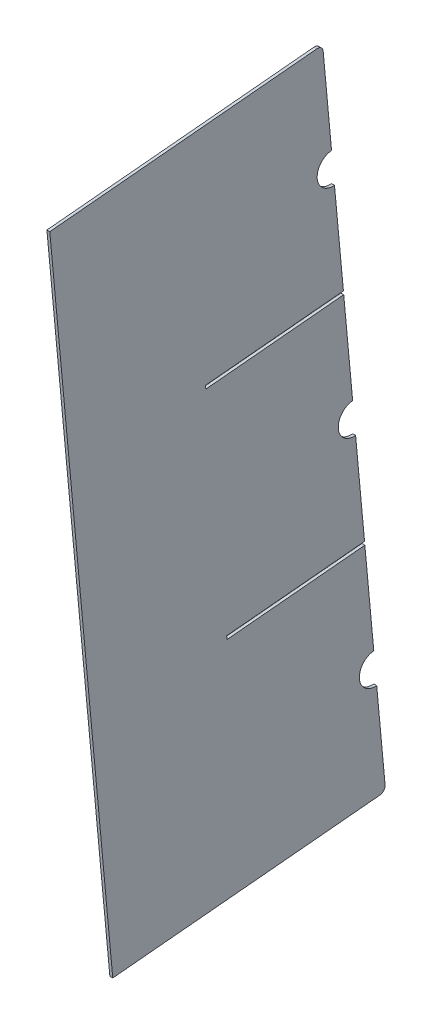
ISO-10303-21;
HEADER;
FILE_DESCRIPTION(('STEP AP214'),'2;1');
FILE_NAME('part.step','',(''),(''),'','','');
FILE_SCHEMA(('AUTOMOTIVE_DESIGN { 1 0 10303 214 1 1 1 1 }'));
ENDSEC;
DATA;
#1=APPLICATION_CONTEXT('core data for automotive mechanical design processes');
#2=APPLICATION_PROTOCOL_DEFINITION('international standard','automotive_design',2000,#1);
#3=PRODUCT_CONTEXT('',#1,'mechanical');
#4=PRODUCT('Part','Part','',(#3));
#5=PRODUCT_RELATED_PRODUCT_CATEGORY('part','',(#4));
#6=PRODUCT_DEFINITION_FORMATION('','',#4);
#7=PRODUCT_DEFINITION_CONTEXT('part definition',#1,'design');
#8=PRODUCT_DEFINITION('design','',#6,#7);
#9=PRODUCT_DEFINITION_SHAPE('','',#8);
#10=(LENGTH_UNIT() NAMED_UNIT(*) SI_UNIT(.MILLI.,.METRE.));
#11=(NAMED_UNIT(*) PLANE_ANGLE_UNIT() SI_UNIT($,.RADIAN.));
#12=(NAMED_UNIT(*) SI_UNIT($,.STERADIAN.) SOLID_ANGLE_UNIT());
#13=UNCERTAINTY_MEASURE_WITH_UNIT(LENGTH_MEASURE(1.E-05),#10,'distance_accuracy_value','');
#14=(GEOMETRIC_REPRESENTATION_CONTEXT(3) GLOBAL_UNCERTAINTY_ASSIGNED_CONTEXT((#13)) GLOBAL_UNIT_ASSIGNED_CONTEXT((#10,
#11,#12)) REPRESENTATION_CONTEXT('',''));
#15=CARTESIAN_POINT('',(0.,0.,0.));
#16=DIRECTION('',(0.,0.,1.));
#17=DIRECTION('',(1.,0.,0.));
#18=AXIS2_PLACEMENT_3D('',#15,#16,#17);
#19=CARTESIAN_POINT('',(-60.4999999998033,-139.63657089351,801.11196170514));
#20=DIRECTION('',(-1.,0.,0.));
#21=DIRECTION('',(0.,-1.,0.));
#22=AXIS2_PLACEMENT_3D('',#19,#20,#21);
#23=CYLINDRICAL_SURFACE('',#22,5.49999999999998);
#24=CARTESIAN_POINT('',(-61.4999999998033,-139.63657089351,801.11196170514));
#25=DIRECTION('',(1.,0.,0.));
#26=DIRECTION('',(0.,1.,0.));
#27=AXIS2_PLACEMENT_3D('',#24,#25,#26);
#28=CIRCLE('',#27,5.49999999999998);
#29=CARTESIAN_POINT('',(-61.4999999998032,-134.16015134012,801.620713978109));
#30=VERTEX_POINT('',#29);
#31=CARTESIAN_POINT('',(-61.4999999998033,-145.112990446899,800.60320943217));
#32=VERTEX_POINT('',#31);
#33=EDGE_CURVE('E203',#30,#32,#28,.T.);
#34=ORIENTED_EDGE('',*,*,#33,.F.);
#35=DIRECTION('',(-1.,0.,0.));
#36=VECTOR('',#35,1.);
#37=CARTESIAN_POINT('',(-60.4999999998033,-134.16015134012,801.620713978109));
#38=LINE('',#37,#36);
#39=CARTESIAN_POINT('',(-60.4999999998033,-134.16015134012,801.620713978109));
#40=VERTEX_POINT('',#39);
#41=EDGE_CURVE('E11',#40,#30,#38,.T.);
#42=ORIENTED_EDGE('',*,*,#41,.F.);
#43=CARTESIAN_POINT('',(-60.4999999998033,-139.63657089351,801.11196170514));
#44=DIRECTION('',(1.,0.,0.));
#45=DIRECTION('',(0.,1.,0.));
#46=AXIS2_PLACEMENT_3D('',#43,#44,#45);
#47=CIRCLE('',#46,5.49999999999998);
#48=CARTESIAN_POINT('',(-60.4999999998033,-145.112990446899,800.60320943217));
#49=VERTEX_POINT('',#48);
#50=EDGE_CURVE('E259',#40,#49,#47,.T.);
#51=ORIENTED_EDGE('',*,*,#50,.T.);
#52=DIRECTION('',(-1.,0.,0.));
#53=VECTOR('',#52,1.);
#54=CARTESIAN_POINT('',(-60.4999999998033,-145.112990446899,800.60320943217));
#55=LINE('',#54,#53);
#56=EDGE_CURVE('E37',#49,#32,#55,.T.);
#57=ORIENTED_EDGE('',*,*,#56,.T.);
#58=EDGE_LOOP('',(#34,#42,#51,#57));
#59=FACE_BOUND('',#58,.T.);
#60=ADVANCED_FACE('F34',(#59),#23,.F.);
#61=CARTESIAN_POINT('',(-60.4999999998031,-100.903348961354,804.710227781234));
#62=DIRECTION('',(0.,0.092500413267217,-0.99571264607084));
#63=DIRECTION('',(0.,0.99571264607084,0.092500413267217));
#64=AXIS2_PLACEMENT_3D('',#61,#62,#63);
#65=PLANE('',#64);
#66=DIRECTION('',(0.,-0.99571264607084,-0.092500413267217));
#67=VECTOR('',#66,1.);
#68=CARTESIAN_POINT('',(-61.4999999998031,-100.903348961354,804.710227781234));
#69=LINE('',#68,#67);
#70=CARTESIAN_POINT('',(-61.4999999998031,-100.903348961354,804.710227781234));
#71=VERTEX_POINT('',#70);
#72=EDGE_CURVE('E257',#71,#30,#69,.T.);
#73=ORIENTED_EDGE('',*,*,#72,.F.);
#74=DIRECTION('',(-1.,0.,0.));
#75=VECTOR('',#74,1.);
#76=CARTESIAN_POINT('',(-60.4999999998031,-100.903348961354,804.710227781234));
#77=LINE('',#76,#75);
#78=CARTESIAN_POINT('',(-60.4999999998031,-100.903348961354,804.710227781234));
#79=VERTEX_POINT('',#78);
#80=EDGE_CURVE('E43',#79,#71,#77,.T.);
#81=ORIENTED_EDGE('',*,*,#80,.F.);
#82=DIRECTION('',(0.,-0.99571264607084,-0.092500413267217));
#83=VECTOR('',#82,1.);
#84=CARTESIAN_POINT('',(-60.4999999998031,-100.903348961354,804.710227781234));
#85=LINE('',#84,#83);
#86=EDGE_CURVE('E193',#79,#40,#85,.T.);
#87=ORIENTED_EDGE('',*,*,#86,.T.);
#88=ORIENTED_EDGE('',*,*,#41,.T.);
#89=EDGE_LOOP('',(#73,#81,#87,#88));
#90=FACE_BOUND('',#89,.T.);
#91=ADVANCED_FACE('F295',(#90),#65,.T.);
#92=CARTESIAN_POINT('',(-60.4999999998031,-105.343368798181,852.504434792638));
#93=DIRECTION('',(0.,0.99571264607084,0.0925004132672172));
#94=DIRECTION('',(0.,-0.0925004132672172,0.99571264607084));
#95=AXIS2_PLACEMENT_3D('',#92,#93,#94);
#96=PLANE('',#95);
#97=DIRECTION('',(0.,0.0925004132672172,-0.99571264607084));
#98=VECTOR('',#97,1.);
#99=CARTESIAN_POINT('',(-61.4999999998031,-105.343368798181,852.504434792638));
#100=LINE('',#99,#98);
#101=CARTESIAN_POINT('',(-61.4999999998031,-105.343368798181,852.504434792638));
#102=VERTEX_POINT('',#101);
#103=EDGE_CURVE('E180',#102,#71,#100,.T.);
#104=ORIENTED_EDGE('',*,*,#103,.F.);
#105=DIRECTION('',(-1.,0.,0.));
#106=VECTOR('',#105,1.);
#107=CARTESIAN_POINT('',(-60.4999999998031,-105.343368798181,852.504434792638));
#108=LINE('',#107,#106);
#109=CARTESIAN_POINT('',(-60.4999999998031,-105.343368798181,852.504434792638));
#110=VERTEX_POINT('',#109);
#111=EDGE_CURVE('E175',#110,#102,#108,.T.);
#112=ORIENTED_EDGE('',*,*,#111,.F.);
#113=DIRECTION('',(0.,0.0925004132672172,-0.99571264607084));
#114=VECTOR('',#113,1.);
#115=CARTESIAN_POINT('',(-60.4999999998031,-105.343368798181,852.504434792638));
#116=LINE('',#115,#114);
#117=EDGE_CURVE('E178',#110,#79,#116,.T.);
#118=ORIENTED_EDGE('',*,*,#117,.T.);
#119=ORIENTED_EDGE('',*,*,#80,.T.);
#120=EDGE_LOOP('',(#104,#112,#118,#119));
#121=FACE_BOUND('',#120,.T.);
#122=ADVANCED_FACE('F177',(#121),#96,.T.);
#123=CARTESIAN_POINT('',(-60.4999999998031,-104.148513622896,852.615435288559));
#124=DIRECTION('',(0.,0.0925004132672718,-0.995712646070835));
#125=DIRECTION('',(0.,0.995712646070835,0.0925004132672718));
#126=AXIS2_PLACEMENT_3D('',#123,#124,#125);
#127=PLANE('',#126);
#128=DIRECTION('',(0.,-0.995712646070835,-0.0925004132672718));
#129=VECTOR('',#128,1.);
#130=CARTESIAN_POINT('',(-61.4999999998031,-104.148513622896,852.615435288559));
#131=LINE('',#130,#129);
#132=CARTESIAN_POINT('',(-61.4999999998031,-104.148513622896,852.615435288559));
#133=VERTEX_POINT('',#132);
#134=EDGE_CURVE('E254',#133,#102,#131,.T.);
#135=ORIENTED_EDGE('',*,*,#134,.F.);
#136=DIRECTION('',(-1.,0.,0.));
#137=VECTOR('',#136,1.);
#138=CARTESIAN_POINT('',(-60.4999999998031,-104.148513622896,852.615435288559));
#139=LINE('',#138,#137);
#140=CARTESIAN_POINT('',(-60.4999999998031,-104.148513622896,852.615435288559));
#141=VERTEX_POINT('',#140);
#142=EDGE_CURVE('E185',#141,#133,#139,.T.);
#143=ORIENTED_EDGE('',*,*,#142,.F.);
#144=DIRECTION('',(0.,-0.995712646070835,-0.0925004132672718));
#145=VECTOR('',#144,1.);
#146=CARTESIAN_POINT('',(-60.4999999998031,-104.148513622896,852.615435288559));
#147=LINE('',#146,#145);
#148=EDGE_CURVE('E191',#141,#110,#147,.T.);
#149=ORIENTED_EDGE('',*,*,#148,.T.);
#150=ORIENTED_EDGE('',*,*,#111,.T.);
#151=EDGE_LOOP('',(#135,#143,#149,#150));
#152=FACE_BOUND('',#151,.T.);
#153=ADVANCED_FACE('F195',(#152),#127,.T.);
#154=CARTESIAN_POINT('',(-60.4999999998031,-99.708493786069,804.821228277155));
#155=DIRECTION('',(0.,-0.99571264607084,-0.092500413267217));
#156=DIRECTION('',(0.,0.092500413267217,-0.99571264607084));
#157=AXIS2_PLACEMENT_3D('',#154,#155,#156);
#158=PLANE('',#157);
#159=DIRECTION('',(0.,-0.092500413267217,0.99571264607084));
#160=VECTOR('',#159,1.);
#161=CARTESIAN_POINT('',(-61.4999999998031,-99.708493786069,804.821228277155));
#162=LINE('',#161,#160);
#163=CARTESIAN_POINT('',(-61.4999999998031,-99.708493786069,804.821228277155));
#164=VERTEX_POINT('',#163);
#165=EDGE_CURVE('E251',#164,#133,#162,.T.);
#166=ORIENTED_EDGE('',*,*,#165,.F.);
#167=DIRECTION('',(-1.,0.,0.));
#168=VECTOR('',#167,1.);
#169=CARTESIAN_POINT('',(-60.4999999998031,-99.708493786069,804.821228277155));
#170=LINE('',#169,#168);
#171=CARTESIAN_POINT('',(-60.4999999998031,-99.708493786069,804.821228277155));
#172=VERTEX_POINT('',#171);
#173=EDGE_CURVE('E263',#172,#164,#170,.T.);
#174=ORIENTED_EDGE('',*,*,#173,.F.);
#175=DIRECTION('',(0.,-0.092500413267217,0.99571264607084));
#176=VECTOR('',#175,1.);
#177=CARTESIAN_POINT('',(-60.4999999998031,-99.708493786069,804.821228277155));
#178=LINE('',#177,#176);
#179=EDGE_CURVE('E196',#172,#141,#178,.T.);
#180=ORIENTED_EDGE('',*,*,#179,.T.);
#181=ORIENTED_EDGE('',*,*,#142,.T.);
#182=EDGE_LOOP('',(#166,#174,#180,#181));
#183=FACE_BOUND('',#182,.T.);
#184=ADVANCED_FACE('F308',(#183),#158,.T.);
#185=CARTESIAN_POINT('',(-60.4999999998029,-66.3521201426958,807.919992121607));
#186=DIRECTION('',(0.,0.0925004132672192,-0.99571264607084));
#187=DIRECTION('',(0.,0.99571264607084,0.0925004132672192));
#188=AXIS2_PLACEMENT_3D('',#185,#186,#187);
#189=PLANE('',#188);
#190=DIRECTION('',(0.,-0.99571264607084,-0.0925004132672192));
#191=VECTOR('',#190,1.);
#192=CARTESIAN_POINT('',(-61.4999999998029,-66.3521201426958,807.919992121607));
#193=LINE('',#192,#191);
#194=CARTESIAN_POINT('',(-61.4999999998029,-66.3521201426958,807.919992121607));
#195=VERTEX_POINT('',#194);
#196=EDGE_CURVE('E248',#195,#164,#193,.T.);
#197=ORIENTED_EDGE('',*,*,#196,.F.);
#198=DIRECTION('',(-1.,0.,0.));
#199=VECTOR('',#198,1.);
#200=CARTESIAN_POINT('',(-60.4999999998029,-66.3521201426958,807.919992121607));
#201=LINE('',#200,#199);
#202=CARTESIAN_POINT('',(-60.4999999998029,-66.3521201426958,807.919992121607));
#203=VERTEX_POINT('',#202);
#204=EDGE_CURVE('E265',#203,#195,#201,.T.);
#205=ORIENTED_EDGE('',*,*,#204,.F.);
#206=DIRECTION('',(0.,-0.99571264607084,-0.0925004132672192));
#207=VECTOR('',#206,1.);
#208=CARTESIAN_POINT('',(-60.4999999998029,-66.3521201426958,807.919992121607));
#209=LINE('',#208,#207);
#210=EDGE_CURVE('E198',#203,#172,#209,.T.);
#211=ORIENTED_EDGE('',*,*,#210,.T.);
#212=ORIENTED_EDGE('',*,*,#173,.T.);
#213=EDGE_LOOP('',(#197,#205,#211,#212));
#214=FACE_BOUND('',#213,.T.);
#215=ADVANCED_FACE('F311',(#214),#189,.T.);
#216=CARTESIAN_POINT('',(-60.4999999998029,-60.8757005893063,808.428744394577));
#217=DIRECTION('',(-1.,0.,0.));
#218=DIRECTION('',(0.,-1.,0.));
#219=AXIS2_PLACEMENT_3D('',#216,#217,#218);
#220=CYLINDRICAL_SURFACE('',#219,5.49999999999996);
#221=CARTESIAN_POINT('',(-61.4999999998029,-60.8757005893063,808.428744394577));
#222=DIRECTION('',(1.,0.,0.));
#223=DIRECTION('',(0.,1.,0.));
#224=AXIS2_PLACEMENT_3D('',#221,#222,#223);
#225=CIRCLE('',#224,5.49999999999996);
#226=CARTESIAN_POINT('',(-61.4999999998028,-55.3992810359167,808.937496667546));
#227=VERTEX_POINT('',#226);
#228=EDGE_CURVE('E245',#227,#195,#225,.T.);
#229=ORIENTED_EDGE('',*,*,#228,.F.);
#230=DIRECTION('',(-1.,0.,0.));
#231=VECTOR('',#230,1.);
#232=CARTESIAN_POINT('',(-60.4999999998029,-55.3992810359167,808.937496667546));
#233=LINE('',#232,#231);
#234=CARTESIAN_POINT('',(-60.4999999998029,-55.3992810359167,808.937496667546));
#235=VERTEX_POINT('',#234);
#236=EDGE_CURVE('E267',#235,#227,#233,.T.);
#237=ORIENTED_EDGE('',*,*,#236,.F.);
#238=CARTESIAN_POINT('',(-60.4999999998029,-60.8757005893063,808.428744394577));
#239=DIRECTION('',(1.,0.,0.));
#240=DIRECTION('',(0.,1.,0.));
#241=AXIS2_PLACEMENT_3D('',#238,#239,#240);
#242=CIRCLE('',#241,5.49999999999996);
#243=EDGE_CURVE('E550',#235,#203,#242,.T.);
#244=ORIENTED_EDGE('',*,*,#243,.T.);
#245=ORIENTED_EDGE('',*,*,#204,.T.);
#246=EDGE_LOOP('',(#229,#237,#244,#245));
#247=FACE_BOUND('',#246,.T.);
#248=ADVANCED_FACE('F315',(#247),#220,.F.);
#249=CARTESIAN_POINT('',(-60.4999999998027,-22.0429073925434,812.036260511998));
#250=DIRECTION('',(0.,0.092500413267219,-0.99571264607084));
#251=DIRECTION('',(0.,0.99571264607084,0.092500413267219));
#252=AXIS2_PLACEMENT_3D('',#249,#250,#251);
#253=PLANE('',#252);
#254=DIRECTION('',(0.,-0.99571264607084,-0.092500413267219));
#255=VECTOR('',#254,1.);
#256=CARTESIAN_POINT('',(-61.4999999998027,-22.0429073925434,812.036260511998));
#257=LINE('',#256,#255);
#258=CARTESIAN_POINT('',(-61.4999999998027,-22.0429073925434,812.036260511998));
#259=VERTEX_POINT('',#258);
#260=EDGE_CURVE('E242',#259,#227,#257,.T.);
#261=ORIENTED_EDGE('',*,*,#260,.F.);
#262=DIRECTION('',(-1.,0.,0.));
#263=VECTOR('',#262,1.);
#264=CARTESIAN_POINT('',(-60.4999999998027,-22.0429073925434,812.036260511998));
#265=LINE('',#264,#263);
#266=CARTESIAN_POINT('',(-60.4999999998027,-22.0429073925434,812.036260511998));
#267=VERTEX_POINT('',#266);
#268=EDGE_CURVE('E269',#267,#259,#265,.T.);
#269=ORIENTED_EDGE('',*,*,#268,.F.);
#270=DIRECTION('',(0.,-0.99571264607084,-0.092500413267219));
#271=VECTOR('',#270,1.);
#272=CARTESIAN_POINT('',(-60.4999999998027,-22.0429073925434,812.036260511998));
#273=LINE('',#272,#271);
#274=EDGE_CURVE('E543',#267,#235,#273,.T.);
#275=ORIENTED_EDGE('',*,*,#274,.T.);
#276=ORIENTED_EDGE('',*,*,#236,.T.);
#277=EDGE_LOOP('',(#261,#269,#275,#276));
#278=FACE_BOUND('',#277,.T.);
#279=ADVANCED_FACE('F319',(#278),#253,.T.);
#280=CARTESIAN_POINT('',(-60.4999999998027,-26.4829272293701,859.830467523402));
#281=DIRECTION('',(0.,0.99571264607084,0.0925004132672169));
#282=DIRECTION('',(0.,-0.0925004132672169,0.99571264607084));
#283=AXIS2_PLACEMENT_3D('',#280,#281,#282);
#284=PLANE('',#283);
#285=DIRECTION('',(0.,0.0925004132672169,-0.99571264607084));
#286=VECTOR('',#285,1.);
#287=CARTESIAN_POINT('',(-61.4999999998027,-26.4829272293701,859.830467523402));
#288=LINE('',#287,#286);
#289=CARTESIAN_POINT('',(-61.4999999998027,-26.4829272293701,859.830467523402));
#290=VERTEX_POINT('',#289);
#291=EDGE_CURVE('E239',#290,#259,#288,.T.);
#292=ORIENTED_EDGE('',*,*,#291,.F.);
#293=DIRECTION('',(-1.,0.,0.));
#294=VECTOR('',#293,1.);
#295=CARTESIAN_POINT('',(-60.4999999998027,-26.4829272293701,859.830467523402));
#296=LINE('',#295,#294);
#297=CARTESIAN_POINT('',(-60.4999999998027,-26.4829272293701,859.830467523402));
#298=VERTEX_POINT('',#297);
#299=EDGE_CURVE('E271',#298,#290,#296,.T.);
#300=ORIENTED_EDGE('',*,*,#299,.F.);
#301=DIRECTION('',(0.,0.0925004132672169,-0.99571264607084));
#302=VECTOR('',#301,1.);
#303=CARTESIAN_POINT('',(-60.4999999998027,-26.4829272293701,859.830467523402));
#304=LINE('',#303,#302);
#305=EDGE_CURVE('E539',#298,#267,#304,.T.);
#306=ORIENTED_EDGE('',*,*,#305,.T.);
#307=ORIENTED_EDGE('',*,*,#268,.T.);
#308=EDGE_LOOP('',(#292,#300,#306,#307));
#309=FACE_BOUND('',#308,.T.);
#310=ADVANCED_FACE('F323',(#309),#284,.T.);
#311=CARTESIAN_POINT('',(-60.4999999998027,-25.2880720540852,859.941468019322));
#312=DIRECTION('',(0.,0.0925004132671777,-0.995712646070844));
#313=DIRECTION('',(0.,0.995712646070844,0.0925004132671777));
#314=AXIS2_PLACEMENT_3D('',#311,#312,#313);
#315=PLANE('',#314);
#316=DIRECTION('',(0.,-0.995712646070844,-0.0925004132671777));
#317=VECTOR('',#316,1.);
#318=CARTESIAN_POINT('',(-61.4999999998027,-25.2880720540852,859.941468019322));
#319=LINE('',#318,#317);
#320=CARTESIAN_POINT('',(-61.4999999998027,-25.2880720540852,859.941468019322));
#321=VERTEX_POINT('',#320);
#322=EDGE_CURVE('E236',#321,#290,#319,.T.);
#323=ORIENTED_EDGE('',*,*,#322,.F.);
#324=DIRECTION('',(-1.,0.,0.));
#325=VECTOR('',#324,1.);
#326=CARTESIAN_POINT('',(-60.4999999998027,-25.2880720540852,859.941468019322));
#327=LINE('',#326,#325);
#328=CARTESIAN_POINT('',(-60.4999999998027,-25.2880720540852,859.941468019322));
#329=VERTEX_POINT('',#328);
#330=EDGE_CURVE('E273',#329,#321,#327,.T.);
#331=ORIENTED_EDGE('',*,*,#330,.F.);
#332=DIRECTION('',(0.,-0.995712646070844,-0.0925004132671777));
#333=VECTOR('',#332,1.);
#334=CARTESIAN_POINT('',(-60.4999999998027,-25.2880720540852,859.941468019322));
#335=LINE('',#334,#333);
#336=EDGE_CURVE('E555',#329,#298,#335,.T.);
#337=ORIENTED_EDGE('',*,*,#336,.T.);
#338=ORIENTED_EDGE('',*,*,#299,.T.);
#339=EDGE_LOOP('',(#323,#331,#337,#338));
#340=FACE_BOUND('',#339,.T.);
#341=ADVANCED_FACE('F327',(#340),#315,.T.);
#342=CARTESIAN_POINT('',(-60.4999999998027,-20.8480522172588,812.147261007922));
#343=DIRECTION('',(0.,-0.99571264607084,-0.0925004132672171));
#344=DIRECTION('',(0.,0.0925004132672171,-0.99571264607084));
#345=AXIS2_PLACEMENT_3D('',#342,#343,#344);
#346=PLANE('',#345);
#347=DIRECTION('',(0.,-0.0925004132672171,0.99571264607084));
#348=VECTOR('',#347,1.);
#349=CARTESIAN_POINT('',(-61.4999999998026,-20.8480522172587,812.147261007922));
#350=LINE('',#349,#348);
#351=CARTESIAN_POINT('',(-61.4999999998026,-20.8480522172587,812.147261007922));
#352=VERTEX_POINT('',#351);
#353=EDGE_CURVE('E233',#352,#321,#350,.T.);
#354=ORIENTED_EDGE('',*,*,#353,.F.);
#355=DIRECTION('',(-1.,0.,0.));
#356=VECTOR('',#355,1.);
#357=CARTESIAN_POINT('',(-60.4999999998027,-20.8480522172588,812.147261007922));
#358=LINE('',#357,#356);
#359=CARTESIAN_POINT('',(-60.4999999998027,-20.8480522172588,812.147261007922));
#360=VERTEX_POINT('',#359);
#361=EDGE_CURVE('E275',#360,#352,#358,.T.);
#362=ORIENTED_EDGE('',*,*,#361,.F.);
#363=DIRECTION('',(0.,-0.0925004132672171,0.99571264607084));
#364=VECTOR('',#363,1.);
#365=CARTESIAN_POINT('',(-60.4999999998027,-20.8480522172588,812.147261007922));
#366=LINE('',#365,#364);
#367=EDGE_CURVE('E532',#360,#329,#366,.T.);
#368=ORIENTED_EDGE('',*,*,#367,.T.);
#369=ORIENTED_EDGE('',*,*,#330,.T.);
#370=EDGE_LOOP('',(#354,#362,#368,#369));
#371=FACE_BOUND('',#370,.T.);
#372=ADVANCED_FACE('F331',(#371),#346,.T.);
#373=CARTESIAN_POINT('',(-60.4999999998025,12.4087501615073,815.236774811047));
#374=DIRECTION('',(0.,0.0925004132672173,-0.99571264607084));
#375=DIRECTION('',(0.,0.99571264607084,0.0925004132672173));
#376=AXIS2_PLACEMENT_3D('',#373,#374,#375);
#377=PLANE('',#376);
#378=DIRECTION('',(0.,-0.99571264607084,-0.0925004132672173));
#379=VECTOR('',#378,1.);
#380=CARTESIAN_POINT('',(-61.4999999998025,12.4087501615073,815.236774811047));
#381=LINE('',#380,#379);
#382=CARTESIAN_POINT('',(-61.4999999998025,12.4087501615073,815.236774811047));
#383=VERTEX_POINT('',#382);
#384=EDGE_CURVE('E230',#383,#352,#381,.T.);
#385=ORIENTED_EDGE('',*,*,#384,.F.);
#386=DIRECTION('',(-1.,0.,0.));
#387=VECTOR('',#386,1.);
#388=CARTESIAN_POINT('',(-60.4999999998025,12.4087501615073,815.236774811047));
#389=LINE('',#388,#387);
#390=CARTESIAN_POINT('',(-60.4999999998025,12.4087501615073,815.236774811047));
#391=VERTEX_POINT('',#390);
#392=EDGE_CURVE('E277',#391,#383,#389,.T.);
#393=ORIENTED_EDGE('',*,*,#392,.F.);
#394=DIRECTION('',(0.,-0.99571264607084,-0.0925004132672173));
#395=VECTOR('',#394,1.);
#396=CARTESIAN_POINT('',(-60.4999999998025,12.4087501615073,815.236774811047));
#397=LINE('',#396,#395);
#398=EDGE_CURVE('E528',#391,#360,#397,.T.);
#399=ORIENTED_EDGE('',*,*,#398,.T.);
#400=ORIENTED_EDGE('',*,*,#361,.T.);
#401=EDGE_LOOP('',(#385,#393,#399,#400));
#402=FACE_BOUND('',#401,.T.);
#403=ADVANCED_FACE('F335',(#402),#377,.T.);
#404=CARTESIAN_POINT('',(-60.4999999998025,17.8851697148972,815.745527084013));
#405=DIRECTION('',(-1.,0.,0.));
#406=DIRECTION('',(0.,-1.,0.));
#407=AXIS2_PLACEMENT_3D('',#404,#405,#406);
#408=CYLINDRICAL_SURFACE('',#407,5.49999999999998);
#409=CARTESIAN_POINT('',(-61.4999999998025,17.8851697148972,815.745527084013));
#410=DIRECTION('',(1.,0.,0.));
#411=DIRECTION('',(0.,1.,0.));
#412=AXIS2_PLACEMENT_3D('',#409,#410,#411);
#413=CIRCLE('',#412,5.49999999999998);
#414=CARTESIAN_POINT('',(-61.4999999998024,23.3615892682868,816.254279356983));
#415=VERTEX_POINT('',#414);
#416=EDGE_CURVE('E227',#415,#383,#413,.T.);
#417=ORIENTED_EDGE('',*,*,#416,.F.);
#418=DIRECTION('',(-1.,0.,0.));
#419=VECTOR('',#418,1.);
#420=CARTESIAN_POINT('',(-60.4999999998025,23.3615892682868,816.254279356983));
#421=LINE('',#420,#419);
#422=CARTESIAN_POINT('',(-60.4999999998025,23.3615892682868,816.254279356983));
#423=VERTEX_POINT('',#422);
#424=EDGE_CURVE('E279',#423,#415,#421,.T.);
#425=ORIENTED_EDGE('',*,*,#424,.F.);
#426=CARTESIAN_POINT('',(-60.4999999998025,17.8851697148972,815.745527084013));
#427=DIRECTION('',(1.,0.,0.));
#428=DIRECTION('',(0.,1.,0.));
#429=AXIS2_PLACEMENT_3D('',#426,#427,#428);
#430=CIRCLE('',#429,5.49999999999998);
#431=EDGE_CURVE('E559',#423,#391,#430,.T.);
#432=ORIENTED_EDGE('',*,*,#431,.T.);
#433=ORIENTED_EDGE('',*,*,#392,.T.);
#434=EDGE_LOOP('',(#417,#425,#432,#433));
#435=FACE_BOUND('',#434,.T.);
#436=ADVANCED_FACE('F339',(#435),#408,.F.);
#437=CARTESIAN_POINT('',(-60.4999999998023,54.6269663549112,819.158792333574));
#438=DIRECTION('',(0.,0.092500413267222,-0.99571264607084));
#439=DIRECTION('',(0.,0.99571264607084,0.092500413267222));
#440=AXIS2_PLACEMENT_3D('',#437,#438,#439);
#441=PLANE('',#440);
#442=DIRECTION('',(0.,-0.995712646070839,-0.092500413267222));
#443=VECTOR('',#442,1.);
#444=CARTESIAN_POINT('',(-61.4999999998023,54.6269663549112,819.158792333574));
#445=LINE('',#444,#443);
#446=CARTESIAN_POINT('',(-61.4999999998023,54.626966354911,819.158792333576));
#447=VERTEX_POINT('',#446);
#448=EDGE_CURVE('E224',#447,#415,#445,.T.);
#449=ORIENTED_EDGE('',*,*,#448,.F.);
#450=DIRECTION('',(-1.,0.,0.));
#451=VECTOR('',#450,1.);
#452=CARTESIAN_POINT('',(-60.4999999998023,54.626966354911,819.158792333576));
#453=LINE('',#452,#451);
#454=CARTESIAN_POINT('',(-60.4999999998023,54.626966354911,819.158792333576));
#455=VERTEX_POINT('',#454);
#456=EDGE_CURVE('E281',#455,#447,#453,.T.);
#457=ORIENTED_EDGE('',*,*,#456,.F.);
#458=DIRECTION('',(0.,-0.995712646070839,-0.092500413267222));
#459=VECTOR('',#458,1.);
#460=CARTESIAN_POINT('',(-60.4999999998023,54.6269663549112,819.158792333574));
#461=LINE('',#460,#459);
#462=EDGE_CURVE('E521',#455,#423,#461,.T.);
#463=ORIENTED_EDGE('',*,*,#462,.T.);
#464=ORIENTED_EDGE('',*,*,#424,.T.);
#465=EDGE_LOOP('',(#449,#457,#463,#464));
#466=FACE_BOUND('',#465,.T.);
#467=ADVANCED_FACE('F343',(#466),#441,.T.);
#468=CARTESIAN_POINT('',(-60.4999999998023,54.4419655283763,821.15021762572));
#469=DIRECTION('',(-1.,0.,0.));
#470=DIRECTION('',(0.,-1.,0.));
#471=AXIS2_PLACEMENT_3D('',#468,#469,#470);
#472=CYLINDRICAL_SURFACE('',#471,2.00000000000213);
#473=CARTESIAN_POINT('',(-61.4999999998023,54.4419655283763,821.15021762572));
#474=DIRECTION('',(-1.,0.,0.));
#475=DIRECTION('',(0.,-1.,0.));
#476=AXIS2_PLACEMENT_3D('',#473,#474,#475);
#477=CIRCLE('',#476,2.00000000000213);
#478=CARTESIAN_POINT('',(-61.4999999998023,56.4333908205182,821.33521845225));
#479=VERTEX_POINT('',#478);
#480=EDGE_CURVE('E221',#479,#447,#477,.T.);
#481=ORIENTED_EDGE('',*,*,#480,.F.);
#482=DIRECTION('',(-1.,0.,0.));
#483=VECTOR('',#482,1.);
#484=CARTESIAN_POINT('',(-60.4999999998023,56.4333908205182,821.33521845225));
#485=LINE('',#484,#483);
#486=CARTESIAN_POINT('',(-60.4999999998023,56.4333908205182,821.33521845225));
#487=VERTEX_POINT('',#486);
#488=EDGE_CURVE('E283',#487,#479,#485,.T.);
#489=ORIENTED_EDGE('',*,*,#488,.F.);
#490=CARTESIAN_POINT('',(-60.4999999998023,54.4419655283763,821.15021762572));
#491=DIRECTION('',(-1.,0.,0.));
#492=DIRECTION('',(0.,-1.,0.));
#493=AXIS2_PLACEMENT_3D('',#490,#491,#492);
#494=CIRCLE('',#493,2.00000000000213);
#495=EDGE_CURVE('E517',#487,#455,#494,.T.);
#496=ORIENTED_EDGE('',*,*,#495,.T.);
#497=ORIENTED_EDGE('',*,*,#456,.T.);
#498=EDGE_LOOP('',(#481,#489,#496,#497));
#499=FACE_BOUND('',#498,.T.);
#500=ADVANCED_FACE('F347',(#499),#472,.T.);
#501=CARTESIAN_POINT('',(-60.4999999998024,47.8308523866686,913.936494536838));
#502=DIRECTION('',(0.,0.995712646070842,0.0925004132671993));
#503=DIRECTION('',(0.,-0.0925004132671993,0.995712646070842));
#504=AXIS2_PLACEMENT_3D('',#501,#502,#503);
#505=PLANE('',#504);
#506=DIRECTION('',(0.,0.0925004132671993,-0.995712646070842));
#507=VECTOR('',#506,1.);
#508=CARTESIAN_POINT('',(-61.4999999998023,47.8308523866686,913.936494536838));
#509=LINE('',#508,#507);
#510=CARTESIAN_POINT('',(-61.4999999998023,47.8308523866686,913.936494536838));
#511=VERTEX_POINT('',#510);
#512=EDGE_CURVE('E218',#511,#479,#509,.T.);
#513=ORIENTED_EDGE('',*,*,#512,.F.);
#514=DIRECTION('',(-1.,0.,0.));
#515=VECTOR('',#514,1.);
#516=CARTESIAN_POINT('',(-60.4999999998024,47.8308523866686,913.936494536838));
#517=LINE('',#516,#515);
#518=CARTESIAN_POINT('',(-60.4999999998024,47.8308523866686,913.936494536838));
#519=VERTEX_POINT('',#518);
#520=EDGE_CURVE('E285',#519,#511,#517,.T.);
#521=ORIENTED_EDGE('',*,*,#520,.F.);
#522=DIRECTION('',(0.,0.0925004132671993,-0.995712646070842));
#523=VECTOR('',#522,1.);
#524=CARTESIAN_POINT('',(-60.4999999998024,47.8308523866686,913.936494536838));
#525=LINE('',#524,#523);
#526=EDGE_CURVE('E563',#519,#487,#525,.T.);
#527=ORIENTED_EDGE('',*,*,#526,.T.);
#528=ORIENTED_EDGE('',*,*,#488,.T.);
#529=EDGE_LOOP('',(#513,#521,#527,#528));
#530=FACE_BOUND('',#529,.T.);
#531=ADVANCED_FACE('F351',(#530),#505,.T.);
#532=CARTESIAN_POINT('',(-60.4999999998036,-187.15733208605,892.106397005779));
#533=DIRECTION('',(0.,-0.0925004132671993,0.995712646070842));
#534=DIRECTION('',(0.,-0.995712646070842,-0.0925004132671993));
#535=AXIS2_PLACEMENT_3D('',#532,#533,#534);
#536=PLANE('',#535);
#537=DIRECTION('',(0.,0.995712646070842,0.0925004132671993));
#538=VECTOR('',#537,1.);
#539=CARTESIAN_POINT('',(-61.4999999998035,-187.15733208605,892.106397005779));
#540=LINE('',#539,#538);
#541=CARTESIAN_POINT('',(-61.4999999998035,-187.15733208605,892.106397005779));
#542=VERTEX_POINT('',#541);
#543=EDGE_CURVE('E215',#542,#511,#540,.T.);
#544=ORIENTED_EDGE('',*,*,#543,.F.);
#545=DIRECTION('',(-1.,0.,0.));
#546=VECTOR('',#545,1.);
#547=CARTESIAN_POINT('',(-60.4999999998036,-187.15733208605,892.106397005779));
#548=LINE('',#547,#546);
#549=CARTESIAN_POINT('',(-60.4999999998036,-187.15733208605,892.106397005779));
#550=VERTEX_POINT('',#549);
#551=EDGE_CURVE('E287',#550,#542,#548,.T.);
#552=ORIENTED_EDGE('',*,*,#551,.F.);
#553=DIRECTION('',(0.,0.995712646070842,0.0925004132671993));
#554=VECTOR('',#553,1.);
#555=CARTESIAN_POINT('',(-60.4999999998036,-187.15733208605,892.106397005779));
#556=LINE('',#555,#554);
#557=EDGE_CURVE('E510',#550,#519,#556,.T.);
#558=ORIENTED_EDGE('',*,*,#557,.T.);
#559=ORIENTED_EDGE('',*,*,#520,.T.);
#560=EDGE_LOOP('',(#544,#552,#558,#559));
#561=FACE_BOUND('',#560,.T.);
#562=ADVANCED_FACE('F355',(#561),#536,.T.);
#563=CARTESIAN_POINT('',(-60.4999999998035,-178.5547936522,799.505120921187));
#564=DIRECTION('',(0.,-0.995712646070842,-0.0925004132671995));
#565=DIRECTION('',(0.,0.0925004132671995,-0.995712646070842));
#566=AXIS2_PLACEMENT_3D('',#563,#564,#565);
#567=PLANE('',#566);
#568=DIRECTION('',(0.,-0.0925004132671994,0.995712646070842));
#569=VECTOR('',#568,1.);
#570=CARTESIAN_POINT('',(-61.4999999998035,-178.5547936522,799.505120921187));
#571=LINE('',#570,#569);
#572=CARTESIAN_POINT('',(-61.4999999998035,-178.554793652199,799.505120921187));
#573=VERTEX_POINT('',#572);
#574=EDGE_CURVE('E212',#573,#542,#571,.T.);
#575=ORIENTED_EDGE('',*,*,#574,.F.);
#576=DIRECTION('',(-1.,0.,0.));
#577=VECTOR('',#576,1.);
#578=CARTESIAN_POINT('',(-60.4999999998035,-178.554793652199,799.505120921187));
#579=LINE('',#578,#577);
#580=CARTESIAN_POINT('',(-60.4999999998035,-178.554793652199,799.505120921187));
#581=VERTEX_POINT('',#580);
#582=EDGE_CURVE('E289',#581,#573,#579,.T.);
#583=ORIENTED_EDGE('',*,*,#582,.F.);
#584=DIRECTION('',(0.,-0.0925004132671994,0.995712646070842));
#585=VECTOR('',#584,1.);
#586=CARTESIAN_POINT('',(-60.4999999998035,-178.5547936522,799.505120921187));
#587=LINE('',#586,#585);
#588=EDGE_CURVE('E506',#581,#550,#587,.T.);
#589=ORIENTED_EDGE('',*,*,#588,.T.);
#590=ORIENTED_EDGE('',*,*,#551,.T.);
#591=EDGE_LOOP('',(#575,#583,#589,#590));
#592=FACE_BOUND('',#591,.T.);
#593=ADVANCED_FACE('F359',(#592),#567,.T.);
#594=CARTESIAN_POINT('',(-60.4999999998035,-176.563368360058,799.69012174772));
#595=DIRECTION('',(-1.,0.,0.));
#596=DIRECTION('',(0.,-1.,0.));
#597=AXIS2_PLACEMENT_3D('',#594,#595,#596);
#598=CYLINDRICAL_SURFACE('',#597,1.99999999999953);
#599=CARTESIAN_POINT('',(-61.4999999998035,-176.563368360058,799.69012174772));
#600=DIRECTION('',(-1.,0.,0.));
#601=DIRECTION('',(0.,-1.,0.));
#602=AXIS2_PLACEMENT_3D('',#599,#600,#601);
#603=CIRCLE('',#602,1.99999999999953);
#604=CARTESIAN_POINT('',(-61.4999999998034,-176.378367533524,797.698696455579));
#605=VERTEX_POINT('',#604);
#606=EDGE_CURVE('E209',#605,#573,#603,.T.);
#607=ORIENTED_EDGE('',*,*,#606,.F.);
#608=DIRECTION('',(-1.,0.,0.));
#609=VECTOR('',#608,1.);
#610=CARTESIAN_POINT('',(-60.4999999998035,-176.378367533524,797.698696455579));
#611=LINE('',#610,#609);
#612=CARTESIAN_POINT('',(-60.4999999998035,-176.378367533524,797.698696455579));
#613=VERTEX_POINT('',#612);
#614=EDGE_CURVE('E290',#613,#605,#611,.T.);
#615=ORIENTED_EDGE('',*,*,#614,.F.);
#616=CARTESIAN_POINT('',(-60.4999999998035,-176.563368360058,799.69012174772));
#617=DIRECTION('',(-1.,0.,0.));
#618=DIRECTION('',(0.,-1.,0.));
#619=AXIS2_PLACEMENT_3D('',#616,#617,#618);
#620=CIRCLE('',#619,1.99999999999953);
#621=EDGE_CURVE('E567',#613,#581,#620,.T.);
#622=ORIENTED_EDGE('',*,*,#621,.T.);
#623=ORIENTED_EDGE('',*,*,#582,.T.);
#624=EDGE_LOOP('',(#607,#615,#622,#623));
#625=FACE_BOUND('',#624,.T.);
#626=ADVANCED_FACE('F363',(#625),#598,.T.);
#627=CARTESIAN_POINT('',(-60.4999999998033,-145.112990446899,800.60320943217));
#628=DIRECTION('',(0.,0.0925004132672189,-0.99571264607084));
#629=DIRECTION('',(0.,0.99571264607084,0.0925004132672189));
#630=AXIS2_PLACEMENT_3D('',#627,#628,#629);
#631=PLANE('',#630);
#632=DIRECTION('',(0.,-0.99571264607084,-0.0925004132672189));
#633=VECTOR('',#632,1.);
#634=CARTESIAN_POINT('',(-61.4999999998033,-145.112990446899,800.60320943217));
#635=LINE('',#634,#633);
#636=EDGE_CURVE('E206',#32,#605,#635,.T.);
#637=ORIENTED_EDGE('',*,*,#636,.F.);
#638=ORIENTED_EDGE('',*,*,#56,.F.);
#639=DIRECTION('',(0.,-0.99571264607084,-0.0925004132672189));
#640=VECTOR('',#639,1.);
#641=CARTESIAN_POINT('',(-60.4999999998033,-145.112990446899,800.60320943217));
#642=LINE('',#641,#640);
#643=EDGE_CURVE('E569',#49,#613,#642,.T.);
#644=ORIENTED_EDGE('',*,*,#643,.T.);
#645=ORIENTED_EDGE('',*,*,#614,.T.);
#646=EDGE_LOOP('',(#637,#638,#644,#645));
#647=FACE_BOUND('',#646,.T.);
#648=ADVANCED_FACE('F292',(#647),#631,.T.);
#649=CARTESIAN_POINT('',(-60.4999999998033,-139.63657089351,801.11196170514));
#650=DIRECTION('',(1.,0.,0.));
#651=DIRECTION('',(0.,1.,0.));
#652=AXIS2_PLACEMENT_3D('',#649,#650,#651);
#653=PLANE('',#652);
#654=ORIENTED_EDGE('',*,*,#50,.F.);
#655=ORIENTED_EDGE('',*,*,#86,.F.);
#656=ORIENTED_EDGE('',*,*,#117,.F.);
#657=ORIENTED_EDGE('',*,*,#148,.F.);
#658=ORIENTED_EDGE('',*,*,#179,.F.);
#659=ORIENTED_EDGE('',*,*,#210,.F.);
#660=ORIENTED_EDGE('',*,*,#243,.F.);
#661=ORIENTED_EDGE('',*,*,#274,.F.);
#662=ORIENTED_EDGE('',*,*,#305,.F.);
#663=ORIENTED_EDGE('',*,*,#336,.F.);
#664=ORIENTED_EDGE('',*,*,#367,.F.);
#665=ORIENTED_EDGE('',*,*,#398,.F.);
#666=ORIENTED_EDGE('',*,*,#431,.F.);
#667=ORIENTED_EDGE('',*,*,#462,.F.);
#668=ORIENTED_EDGE('',*,*,#495,.F.);
#669=ORIENTED_EDGE('',*,*,#526,.F.);
#670=ORIENTED_EDGE('',*,*,#557,.F.);
#671=ORIENTED_EDGE('',*,*,#588,.F.);
#672=ORIENTED_EDGE('',*,*,#621,.F.);
#673=ORIENTED_EDGE('',*,*,#643,.F.);
#674=EDGE_LOOP('',(#654,#655,#656,#657,#658,#659,#660,#661,#662,#663,#664,#665,#666,#667,#668,
#669,#670,#671,#672,#673));
#675=FACE_BOUND('',#674,.T.);
#676=ADVANCED_FACE('F189',(#675),#653,.T.);
#677=CARTESIAN_POINT('',(-61.4999999998033,-139.63657089351,801.11196170514));
#678=DIRECTION('',(1.,0.,0.));
#679=DIRECTION('',(0.,1.,0.));
#680=AXIS2_PLACEMENT_3D('',#677,#678,#679);
#681=PLANE('',#680);
#682=ORIENTED_EDGE('',*,*,#33,.T.);
#683=ORIENTED_EDGE('',*,*,#636,.T.);
#684=ORIENTED_EDGE('',*,*,#606,.T.);
#685=ORIENTED_EDGE('',*,*,#574,.T.);
#686=ORIENTED_EDGE('',*,*,#543,.T.);
#687=ORIENTED_EDGE('',*,*,#512,.T.);
#688=ORIENTED_EDGE('',*,*,#480,.T.);
#689=ORIENTED_EDGE('',*,*,#448,.T.);
#690=ORIENTED_EDGE('',*,*,#416,.T.);
#691=ORIENTED_EDGE('',*,*,#384,.T.);
#692=ORIENTED_EDGE('',*,*,#353,.T.);
#693=ORIENTED_EDGE('',*,*,#322,.T.);
#694=ORIENTED_EDGE('',*,*,#291,.T.);
#695=ORIENTED_EDGE('',*,*,#260,.T.);
#696=ORIENTED_EDGE('',*,*,#228,.T.);
#697=ORIENTED_EDGE('',*,*,#196,.T.);
#698=ORIENTED_EDGE('',*,*,#165,.T.);
#699=ORIENTED_EDGE('',*,*,#134,.T.);
#700=ORIENTED_EDGE('',*,*,#103,.T.);
#701=ORIENTED_EDGE('',*,*,#72,.T.);
#702=EDGE_LOOP('',(#682,#683,#684,#685,#686,#687,#688,#689,#690,#691,#692,#693,#694,#695,#696,
#697,#698,#699,#700,#701));
#703=FACE_BOUND('',#702,.T.);
#704=ADVANCED_FACE('F294',(#703),#681,.F.);
#705=CLOSED_SHELL('',(#60,#91,#122,#153,#184,#215,#248,#279,#310,#341,#372,#403,#436,#467,#500,
#531,#562,#593,#626,#648,#676,#704));
#706=MANIFOLD_SOLID_BREP('B2',#705);
#707=ADVANCED_BREP_SHAPE_REPRESENTATION('',(#18,#706),#14);
#708=SHAPE_DEFINITION_REPRESENTATION(#9,#707);
ENDSEC;
END-ISO-10303-21;
